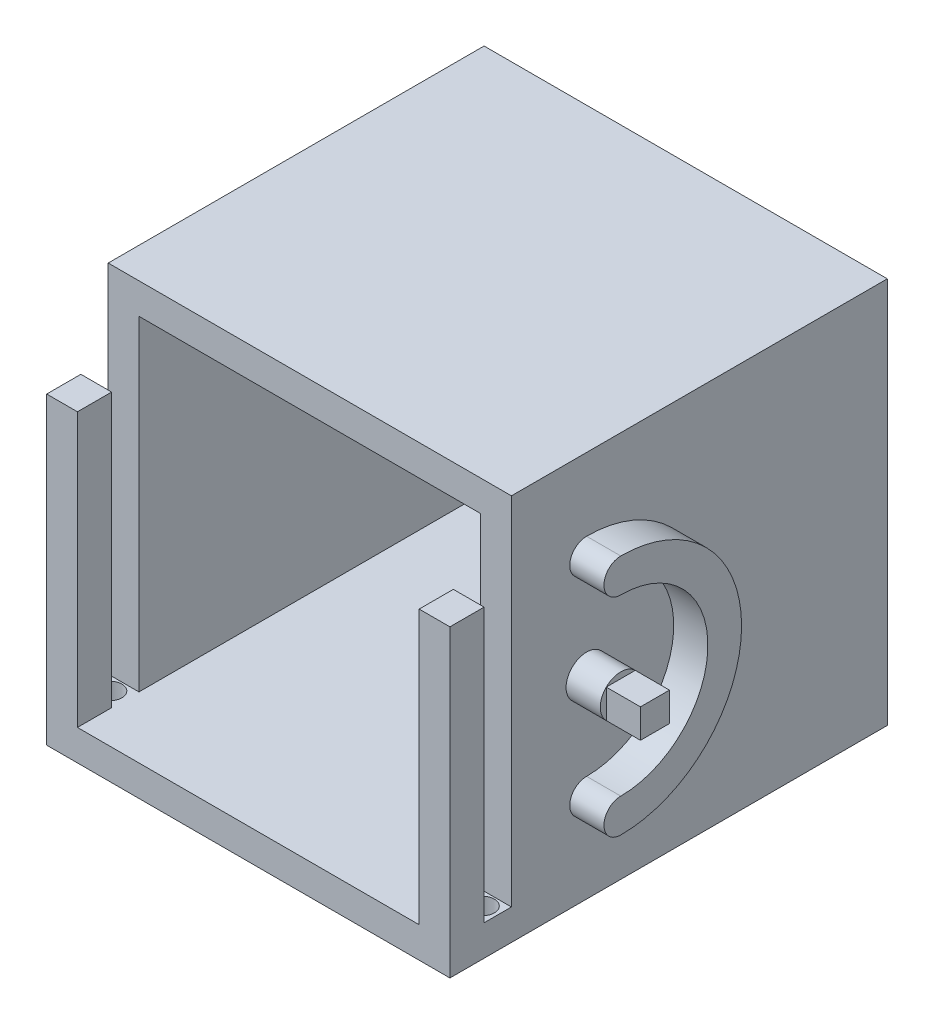
ISO-10303-21;
HEADER;
FILE_DESCRIPTION(('STEP AP214'),'2;1');
FILE_NAME('part.step','',(''),(''),'','','');
FILE_SCHEMA(('AUTOMOTIVE_DESIGN { 1 0 10303 214 1 1 1 1 }'));
ENDSEC;
DATA;
#1=APPLICATION_CONTEXT('core data for automotive mechanical design processes');
#2=APPLICATION_PROTOCOL_DEFINITION('international standard','automotive_design',2000,#1);
#3=PRODUCT_CONTEXT('',#1,'mechanical');
#4=PRODUCT('Part','Part','',(#3));
#5=PRODUCT_RELATED_PRODUCT_CATEGORY('part','',(#4));
#6=PRODUCT_DEFINITION_FORMATION('','',#4);
#7=PRODUCT_DEFINITION_CONTEXT('part definition',#1,'design');
#8=PRODUCT_DEFINITION('design','',#6,#7);
#9=PRODUCT_DEFINITION_SHAPE('','',#8);
#10=(LENGTH_UNIT() NAMED_UNIT(*) SI_UNIT(.MILLI.,.METRE.));
#11=(NAMED_UNIT(*) PLANE_ANGLE_UNIT() SI_UNIT($,.RADIAN.));
#12=(NAMED_UNIT(*) SI_UNIT($,.STERADIAN.) SOLID_ANGLE_UNIT());
#13=UNCERTAINTY_MEASURE_WITH_UNIT(LENGTH_MEASURE(1.E-05),#10,'distance_accuracy_value','');
#14=(GEOMETRIC_REPRESENTATION_CONTEXT(3) GLOBAL_UNCERTAINTY_ASSIGNED_CONTEXT((#13)) GLOBAL_UNIT_ASSIGNED_CONTEXT((#10,
#11,#12)) REPRESENTATION_CONTEXT('',''));
#15=CARTESIAN_POINT('',(0.,0.,0.));
#16=DIRECTION('',(0.,0.,1.));
#17=DIRECTION('',(1.,0.,0.));
#18=AXIS2_PLACEMENT_3D('',#15,#16,#17);
#19=CARTESIAN_POINT('',(34.5,0.,44.));
#20=DIRECTION('',(1.,0.,0.));
#21=DIRECTION('',(0.,0.,-1.));
#22=AXIS2_PLACEMENT_3D('',#19,#20,#21);
#23=PLANE('',#22);
#24=DIRECTION('',(0.,-1.,0.));
#25=VECTOR('',#24,1.);
#26=CARTESIAN_POINT('',(34.5,-2.12132034355965,46.1213203435596));
#27=LINE('',#26,#25);
#28=CARTESIAN_POINT('',(34.5,2.12132034355963,46.1213203435596));
#29=VERTEX_POINT('',#28);
#30=CARTESIAN_POINT('',(34.5,-2.12132034355965,46.1213203435596));
#31=VERTEX_POINT('',#30);
#32=EDGE_CURVE('E62',#29,#31,#27,.T.);
#33=ORIENTED_EDGE('',*,*,#32,.F.);
#34=CARTESIAN_POINT('',(34.5,0.,44.));
#35=DIRECTION('',(1.,0.,0.));
#36=DIRECTION('',(0.,0.,-1.));
#37=AXIS2_PLACEMENT_3D('',#34,#35,#36);
#38=CIRCLE('',#37,3.);
#39=EDGE_CURVE('E268',#29,#31,#38,.T.);
#40=ORIENTED_EDGE('',*,*,#39,.T.);
#41=EDGE_LOOP('',(#33,#40));
#42=FACE_BOUND('',#41,.T.);
#43=ADVANCED_FACE('F41',(#42),#23,.T.);
#44=DIRECTION('',(0.,0.,1.));
#45=VECTOR('',#44,1.);
#46=CARTESIAN_POINT('',(34.5,2.12132034355963,46.1213203435596));
#47=LINE('',#46,#45);
#48=CARTESIAN_POINT('',(34.5,2.12132034355963,41.8786796564403));
#49=VERTEX_POINT('',#48);
#50=EDGE_CURVE('E222',#49,#29,#47,.T.);
#51=ORIENTED_EDGE('',*,*,#50,.F.);
#52=EDGE_CURVE('E264',#49,#29,#38,.T.);
#53=ORIENTED_EDGE('',*,*,#52,.T.);
#54=EDGE_LOOP('',(#51,#53));
#55=FACE_BOUND('',#54,.T.);
#56=ADVANCED_FACE('F421',(#55),#23,.T.);
#57=DIRECTION('',(0.,1.,0.));
#58=VECTOR('',#57,1.);
#59=CARTESIAN_POINT('',(34.5,-2.12132034355965,41.8786796564403));
#60=LINE('',#59,#58);
#61=CARTESIAN_POINT('',(34.5,-2.12132034355965,41.8786796564403));
#62=VERTEX_POINT('',#61);
#63=EDGE_CURVE('E450',#62,#49,#60,.T.);
#64=ORIENTED_EDGE('',*,*,#63,.F.);
#65=EDGE_CURVE('E256',#62,#49,#38,.T.);
#66=ORIENTED_EDGE('',*,*,#65,.T.);
#67=EDGE_LOOP('',(#64,#66));
#68=FACE_BOUND('',#67,.T.);
#69=ADVANCED_FACE('F418',(#68),#23,.T.);
#70=CARTESIAN_POINT('',(-34.5,0.,44.));
#71=DIRECTION('',(1.,0.,0.));
#72=DIRECTION('',(0.,0.,1.));
#73=AXIS2_PLACEMENT_3D('',#70,#71,#72);
#74=CYLINDRICAL_SURFACE('',#73,3.);
#75=CARTESIAN_POINT('',(-34.5,0.,44.));
#76=DIRECTION('',(1.,0.,0.));
#77=DIRECTION('',(0.,0.,-1.));
#78=AXIS2_PLACEMENT_3D('',#75,#76,#77);
#79=CIRCLE('',#78,3.);
#80=CARTESIAN_POINT('',(-34.5,0.,41.));
#81=VERTEX_POINT('',#80);
#82=EDGE_CURVE('E49',#81,#81,#79,.T.);
#83=ORIENTED_EDGE('',*,*,#82,.T.);
#84=EDGE_LOOP('',(#83));
#85=FACE_BOUND('',#84,.T.);
#86=CARTESIAN_POINT('',(-29.5,0.,44.));
#87=DIRECTION('',(-1.,0.,0.));
#88=DIRECTION('',(0.,0.,1.));
#89=AXIS2_PLACEMENT_3D('',#86,#87,#88);
#90=CIRCLE('',#89,3.);
#91=CARTESIAN_POINT('',(-29.5,0.,47.));
#92=VERTEX_POINT('',#91);
#93=EDGE_CURVE('E11',#92,#92,#90,.F.);
#94=ORIENTED_EDGE('',*,*,#93,.F.);
#95=EDGE_LOOP('',(#94));
#96=FACE_BOUND('',#95,.T.);
#97=ADVANCED_FACE('F43',(#85,#96),#74,.T.);
#98=CARTESIAN_POINT('',(-34.5,0.,44.));
#99=DIRECTION('',(-1.,0.,0.));
#100=DIRECTION('',(0.,0.,-1.));
#101=AXIS2_PLACEMENT_3D('',#98,#99,#100);
#102=PLANE('',#101);
#103=ORIENTED_EDGE('',*,*,#82,.F.);
#104=EDGE_LOOP('',(#103));
#105=FACE_BOUND('',#104,.T.);
#106=ADVANCED_FACE('F407',(#105),#102,.T.);
#107=CARTESIAN_POINT('',(29.5,0.,3.));
#108=DIRECTION('',(-1.,0.,0.));
#109=DIRECTION('',(0.,0.,1.));
#110=AXIS2_PLACEMENT_3D('',#107,#108,#109);
#111=PLANE('',#110);
#112=DIRECTION('',(0.,1.,0.));
#113=VECTOR('',#112,1.);
#114=CARTESIAN_POINT('',(29.5,0.,0.));
#115=LINE('',#114,#113);
#116=CARTESIAN_POINT('',(29.5,-28.3,0.));
#117=VERTEX_POINT('',#116);
#118=CARTESIAN_POINT('',(29.5,28.3,0.));
#119=VERTEX_POINT('',#118);
#120=EDGE_CURVE('E385',#117,#119,#115,.T.);
#121=ORIENTED_EDGE('',*,*,#120,.T.);
#122=DIRECTION('',(0.,0.,-1.));
#123=VECTOR('',#122,1.);
#124=CARTESIAN_POINT('',(29.5,28.3,3.));
#125=LINE('',#124,#123);
#126=CARTESIAN_POINT('',(29.5,28.3,55.));
#127=VERTEX_POINT('',#126);
#128=EDGE_CURVE('E393',#127,#119,#125,.T.);
#129=ORIENTED_EDGE('',*,*,#128,.F.);
#130=DIRECTION('',(0.,-1.,0.));
#131=VECTOR('',#130,1.);
#132=CARTESIAN_POINT('',(29.5,0.,55.));
#133=LINE('',#132,#131);
#134=CARTESIAN_POINT('',(29.5,-23.8,55.));
#135=VERTEX_POINT('',#134);
#136=EDGE_CURVE('E375',#127,#135,#133,.T.);
#137=ORIENTED_EDGE('',*,*,#136,.T.);
#138=DIRECTION('',(0.,0.,-1.));
#139=VECTOR('',#138,1.);
#140=CARTESIAN_POINT('',(29.5,-23.8,59.));
#141=LINE('',#140,#139);
#142=CARTESIAN_POINT('',(29.5,-23.8,59.));
#143=VERTEX_POINT('',#142);
#144=EDGE_CURVE('E340',#143,#135,#141,.T.);
#145=ORIENTED_EDGE('',*,*,#144,.F.);
#146=DIRECTION('',(0.,1.,0.));
#147=VECTOR('',#146,1.);
#148=CARTESIAN_POINT('',(29.5,16.2,59.));
#149=LINE('',#148,#147);
#150=CARTESIAN_POINT('',(29.5,16.2,59.));
#151=VERTEX_POINT('',#150);
#152=EDGE_CURVE('E272',#143,#151,#149,.T.);
#153=ORIENTED_EDGE('',*,*,#152,.T.);
#154=DIRECTION('',(0.,0.,-1.));
#155=VECTOR('',#154,1.);
#156=CARTESIAN_POINT('',(29.5,16.2,64.));
#157=LINE('',#156,#155);
#158=CARTESIAN_POINT('',(29.5,16.2,64.));
#159=VERTEX_POINT('',#158);
#160=EDGE_CURVE('E327',#159,#151,#157,.T.);
#161=ORIENTED_EDGE('',*,*,#160,.F.);
#162=DIRECTION('',(0.,1.,0.));
#163=VECTOR('',#162,1.);
#164=CARTESIAN_POINT('',(29.5,16.2,64.));
#165=LINE('',#164,#163);
#166=CARTESIAN_POINT('',(29.5,-28.3,64.));
#167=VERTEX_POINT('',#166);
#168=EDGE_CURVE('E284',#167,#159,#165,.T.);
#169=ORIENTED_EDGE('',*,*,#168,.F.);
#170=DIRECTION('',(0.,0.,-1.));
#171=VECTOR('',#170,1.);
#172=CARTESIAN_POINT('',(29.5,-28.3,3.));
#173=LINE('',#172,#171);
#174=EDGE_CURVE('E395',#167,#117,#173,.T.);
#175=ORIENTED_EDGE('',*,*,#174,.T.);
#176=EDGE_LOOP('',(#121,#129,#137,#145,#153,#161,#169,#175));
#177=FACE_BOUND('',#176,.T.);
#178=CARTESIAN_POINT('',(29.5,0.,44.));
#179=DIRECTION('',(-1.,0.,0.));
#180=DIRECTION('',(0.,0.,1.));
#181=AXIS2_PLACEMENT_3D('',#178,#179,#180);
#182=CIRCLE('',#181,3.);
#183=CARTESIAN_POINT('',(29.5,0.,47.));
#184=VERTEX_POINT('',#183);
#185=EDGE_CURVE('E400',#184,#184,#182,.F.);
#186=ORIENTED_EDGE('',*,*,#185,.F.);
#187=EDGE_LOOP('',(#186));
#188=FACE_BOUND('',#187,.T.);
#189=CARTESIAN_POINT('',(29.5,-15.2126091568228,44.));
#190=DIRECTION('',(1.,0.,0.));
#191=DIRECTION('',(0.,0.,-1.));
#192=AXIS2_PLACEMENT_3D('',#189,#190,#191);
#193=CIRCLE('',#192,2.46506037284086);
#194=CARTESIAN_POINT('',(29.5,-12.747548783982,44.));
#195=VERTEX_POINT('',#194);
#196=CARTESIAN_POINT('',(29.5,-17.6776695296637,44.));
#197=VERTEX_POINT('',#196);
#198=EDGE_CURVE('E253',#195,#197,#193,.T.);
#199=ORIENTED_EDGE('',*,*,#198,.F.);
#200=CARTESIAN_POINT('',(29.5,0.,44.));
#201=DIRECTION('',(-1.,0.,0.));
#202=DIRECTION('',(0.,0.,-1.));
#203=AXIS2_PLACEMENT_3D('',#200,#201,#202);
#204=CIRCLE('',#203,12.747548783982);
#205=CARTESIAN_POINT('',(29.5,12.747548783982,44.));
#206=VERTEX_POINT('',#205);
#207=EDGE_CURVE('E243',#206,#195,#204,.T.);
#208=ORIENTED_EDGE('',*,*,#207,.F.);
#209=CARTESIAN_POINT('',(29.5,15.2126091568229,44.));
#210=DIRECTION('',(1.,0.,0.));
#211=DIRECTION('',(0.,0.,-1.));
#212=AXIS2_PLACEMENT_3D('',#209,#210,#211);
#213=CIRCLE('',#212,2.46506037284086);
#214=CARTESIAN_POINT('',(29.5,17.6776695296637,44.));
#215=VERTEX_POINT('',#214);
#216=EDGE_CURVE('E246',#215,#206,#213,.T.);
#217=ORIENTED_EDGE('',*,*,#216,.F.);
#218=CARTESIAN_POINT('',(29.5,0.,44.));
#219=DIRECTION('',(1.,0.,0.));
#220=DIRECTION('',(0.,0.,-1.));
#221=AXIS2_PLACEMENT_3D('',#218,#219,#220);
#222=CIRCLE('',#221,17.6776695296637);
#223=EDGE_CURVE('E250',#197,#215,#222,.T.);
#224=ORIENTED_EDGE('',*,*,#223,.F.);
#225=EDGE_LOOP('',(#199,#208,#217,#224));
#226=FACE_BOUND('',#225,.T.);
#227=ADVANCED_FACE('F409',(#177,#188,#226),#111,.F.);
#228=CARTESIAN_POINT('',(0.,0.,55.));
#229=DIRECTION('',(0.,0.,-1.));
#230=DIRECTION('',(-1.,0.,0.));
#231=AXIS2_PLACEMENT_3D('',#228,#229,#230);
#232=PLANE('',#231);
#233=DIRECTION('',(-1.,0.,0.));
#234=VECTOR('',#233,1.);
#235=CARTESIAN_POINT('',(-29.5,-23.8,55.));
#236=LINE('',#235,#234);
#237=CARTESIAN_POINT('',(25.,-23.8,55.));
#238=VERTEX_POINT('',#237);
#239=EDGE_CURVE('E330',#135,#238,#236,.T.);
#240=ORIENTED_EDGE('',*,*,#239,.F.);
#241=ORIENTED_EDGE('',*,*,#136,.F.);
#242=DIRECTION('',(1.,0.,0.));
#243=VECTOR('',#242,1.);
#244=CARTESIAN_POINT('',(0.,28.3,55.));
#245=LINE('',#244,#243);
#246=CARTESIAN_POINT('',(-29.5,28.3,55.));
#247=VERTEX_POINT('',#246);
#248=EDGE_CURVE('E367',#247,#127,#245,.T.);
#249=ORIENTED_EDGE('',*,*,#248,.F.);
#250=DIRECTION('',(0.,1.,0.));
#251=VECTOR('',#250,1.);
#252=CARTESIAN_POINT('',(-29.5,0.,55.));
#253=LINE('',#252,#251);
#254=CARTESIAN_POINT('',(-29.5,-23.8,55.));
#255=VERTEX_POINT('',#254);
#256=EDGE_CURVE('E378',#255,#247,#253,.T.);
#257=ORIENTED_EDGE('',*,*,#256,.F.);
#258=CARTESIAN_POINT('',(-25.,-23.8,55.));
#259=VERTEX_POINT('',#258);
#260=EDGE_CURVE('E337',#259,#255,#236,.T.);
#261=ORIENTED_EDGE('',*,*,#260,.F.);
#262=DIRECTION('',(0.,1.,0.));
#263=VECTOR('',#262,1.);
#264=CARTESIAN_POINT('',(-25.,0.,55.));
#265=LINE('',#264,#263);
#266=CARTESIAN_POINT('',(-25.,23.8,55.));
#267=VERTEX_POINT('',#266);
#268=EDGE_CURVE('E351',#259,#267,#265,.T.);
#269=ORIENTED_EDGE('',*,*,#268,.T.);
#270=DIRECTION('',(1.,0.,0.));
#271=VECTOR('',#270,1.);
#272=CARTESIAN_POINT('',(0.,23.8,55.));
#273=LINE('',#272,#271);
#274=CARTESIAN_POINT('',(25.,23.8,55.));
#275=VERTEX_POINT('',#274);
#276=EDGE_CURVE('E344',#267,#275,#273,.T.);
#277=ORIENTED_EDGE('',*,*,#276,.T.);
#278=DIRECTION('',(0.,-1.,0.));
#279=VECTOR('',#278,1.);
#280=CARTESIAN_POINT('',(25.,0.,55.));
#281=LINE('',#280,#279);
#282=EDGE_CURVE('E347',#275,#238,#281,.T.);
#283=ORIENTED_EDGE('',*,*,#282,.T.);
#284=EDGE_LOOP('',(#240,#241,#249,#257,#261,#269,#277,#283));
#285=FACE_BOUND('',#284,.T.);
#286=ADVANCED_FACE('F415',(#285),#232,.F.);
#287=CARTESIAN_POINT('',(-29.5,0.,3.));
#288=DIRECTION('',(-1.,0.,0.));
#289=DIRECTION('',(0.,0.,1.));
#290=AXIS2_PLACEMENT_3D('',#287,#288,#289);
#291=PLANE('',#290);
#292=ORIENTED_EDGE('',*,*,#93,.T.);
#293=EDGE_LOOP('',(#292));
#294=FACE_BOUND('',#293,.T.);
#295=DIRECTION('',(0.,1.,0.));
#296=VECTOR('',#295,1.);
#297=CARTESIAN_POINT('',(-29.5,0.,0.));
#298=LINE('',#297,#296);
#299=CARTESIAN_POINT('',(-29.5,-28.3,0.));
#300=VERTEX_POINT('',#299);
#301=CARTESIAN_POINT('',(-29.5,28.3,0.));
#302=VERTEX_POINT('',#301);
#303=EDGE_CURVE('E380',#300,#302,#298,.T.);
#304=ORIENTED_EDGE('',*,*,#303,.F.);
#305=DIRECTION('',(0.,0.,-1.));
#306=VECTOR('',#305,1.);
#307=CARTESIAN_POINT('',(-29.5,-28.3,3.));
#308=LINE('',#307,#306);
#309=CARTESIAN_POINT('',(-29.5,-28.3,64.));
#310=VERTEX_POINT('',#309);
#311=EDGE_CURVE('E398',#310,#300,#308,.T.);
#312=ORIENTED_EDGE('',*,*,#311,.F.);
#313=DIRECTION('',(0.,-1.,0.));
#314=VECTOR('',#313,1.);
#315=CARTESIAN_POINT('',(-29.5,-28.3,64.));
#316=LINE('',#315,#314);
#317=CARTESIAN_POINT('',(-29.5,16.2,64.));
#318=VERTEX_POINT('',#317);
#319=EDGE_CURVE('E297',#318,#310,#316,.T.);
#320=ORIENTED_EDGE('',*,*,#319,.F.);
#321=DIRECTION('',(0.,0.,-1.));
#322=VECTOR('',#321,1.);
#323=CARTESIAN_POINT('',(-29.5,16.2,64.));
#324=LINE('',#323,#322);
#325=CARTESIAN_POINT('',(-29.5,16.2,59.));
#326=VERTEX_POINT('',#325);
#327=EDGE_CURVE('E300',#318,#326,#324,.T.);
#328=ORIENTED_EDGE('',*,*,#327,.T.);
#329=DIRECTION('',(0.,-1.,0.));
#330=VECTOR('',#329,1.);
#331=CARTESIAN_POINT('',(-29.5,-28.3,59.));
#332=LINE('',#331,#330);
#333=CARTESIAN_POINT('',(-29.5,-23.8,59.));
#334=VERTEX_POINT('',#333);
#335=EDGE_CURVE('E285',#326,#334,#332,.T.);
#336=ORIENTED_EDGE('',*,*,#335,.T.);
#337=DIRECTION('',(0.,0.,-1.));
#338=VECTOR('',#337,1.);
#339=CARTESIAN_POINT('',(-29.5,-23.8,59.));
#340=LINE('',#339,#338);
#341=EDGE_CURVE('E333',#334,#255,#340,.T.);
#342=ORIENTED_EDGE('',*,*,#341,.T.);
#343=ORIENTED_EDGE('',*,*,#256,.T.);
#344=DIRECTION('',(0.,0.,-1.));
#345=VECTOR('',#344,1.);
#346=CARTESIAN_POINT('',(-29.5,28.3,3.));
#347=LINE('',#346,#345);
#348=EDGE_CURVE('E391',#247,#302,#347,.T.);
#349=ORIENTED_EDGE('',*,*,#348,.T.);
#350=EDGE_LOOP('',(#304,#312,#320,#328,#336,#342,#343,#349));
#351=FACE_BOUND('',#350,.T.);
#352=ADVANCED_FACE('F691',(#294,#351),#291,.T.);
#353=CARTESIAN_POINT('',(0.,-28.3,3.));
#354=DIRECTION('',(0.,1.,0.));
#355=DIRECTION('',(0.,0.,1.));
#356=AXIS2_PLACEMENT_3D('',#353,#354,#355);
#357=PLANE('',#356);
#358=CARTESIAN_POINT('',(-27.25,-28.3,57.));
#359=DIRECTION('',(0.,1.,0.));
#360=DIRECTION('',(0.,0.,1.));
#361=AXIS2_PLACEMENT_3D('',#358,#359,#360);
#362=CIRCLE('',#361,1.75);
#363=CARTESIAN_POINT('',(-27.25,-28.3,58.75));
#364=VERTEX_POINT('',#363);
#365=EDGE_CURVE('E269',#364,#364,#362,.T.);
#366=ORIENTED_EDGE('',*,*,#365,.T.);
#367=EDGE_LOOP('',(#366));
#368=FACE_BOUND('',#367,.T.);
#369=CARTESIAN_POINT('',(27.25,-28.3,57.));
#370=DIRECTION('',(0.,1.,0.));
#371=DIRECTION('',(0.,0.,1.));
#372=AXIS2_PLACEMENT_3D('',#369,#370,#371);
#373=CIRCLE('',#372,1.75);
#374=CARTESIAN_POINT('',(27.25,-28.3,58.75));
#375=VERTEX_POINT('',#374);
#376=EDGE_CURVE('E267',#375,#375,#373,.T.);
#377=ORIENTED_EDGE('',*,*,#376,.T.);
#378=EDGE_LOOP('',(#377));
#379=FACE_BOUND('',#378,.T.);
#380=DIRECTION('',(1.,0.,0.));
#381=VECTOR('',#380,1.);
#382=CARTESIAN_POINT('',(0.,-28.3,0.));
#383=LINE('',#382,#381);
#384=EDGE_CURVE('E383',#300,#117,#383,.T.);
#385=ORIENTED_EDGE('',*,*,#384,.T.);
#386=ORIENTED_EDGE('',*,*,#174,.F.);
#387=DIRECTION('',(1.,0.,0.));
#388=VECTOR('',#387,1.);
#389=CARTESIAN_POINT('',(29.5,-28.3,64.));
#390=LINE('',#389,#388);
#391=EDGE_CURVE('E281',#310,#167,#390,.T.);
#392=ORIENTED_EDGE('',*,*,#391,.F.);
#393=ORIENTED_EDGE('',*,*,#311,.T.);
#394=EDGE_LOOP('',(#385,#386,#392,#393));
#395=FACE_BOUND('',#394,.T.);
#396=ADVANCED_FACE('F760',(#368,#379,#395),#357,.F.);
#397=CARTESIAN_POINT('',(0.,28.3,3.));
#398=DIRECTION('',(0.,1.,0.));
#399=DIRECTION('',(-1.,0.,0.));
#400=AXIS2_PLACEMENT_3D('',#397,#398,#399);
#401=PLANE('',#400);
#402=DIRECTION('',(1.,0.,0.));
#403=VECTOR('',#402,1.);
#404=CARTESIAN_POINT('',(0.,28.3,0.));
#405=LINE('',#404,#403);
#406=EDGE_CURVE('E388',#302,#119,#405,.T.);
#407=ORIENTED_EDGE('',*,*,#406,.F.);
#408=ORIENTED_EDGE('',*,*,#348,.F.);
#409=ORIENTED_EDGE('',*,*,#248,.T.);
#410=ORIENTED_EDGE('',*,*,#128,.T.);
#411=EDGE_LOOP('',(#407,#408,#409,#410));
#412=FACE_BOUND('',#411,.T.);
#413=ADVANCED_FACE('F751',(#412),#401,.T.);
#414=CARTESIAN_POINT('',(0.,0.,0.));
#415=DIRECTION('',(0.,0.,1.));
#416=DIRECTION('',(1.,0.,0.));
#417=AXIS2_PLACEMENT_3D('',#414,#415,#416);
#418=PLANE('',#417);
#419=ORIENTED_EDGE('',*,*,#303,.T.);
#420=ORIENTED_EDGE('',*,*,#406,.T.);
#421=ORIENTED_EDGE('',*,*,#120,.F.);
#422=ORIENTED_EDGE('',*,*,#384,.F.);
#423=EDGE_LOOP('',(#419,#420,#421,#422));
#424=FACE_BOUND('',#423,.T.);
#425=ADVANCED_FACE('F732',(#424),#418,.F.);
#426=CARTESIAN_POINT('',(0.,23.8,55.));
#427=DIRECTION('',(0.,1.,0.));
#428=DIRECTION('',(0.,0.,1.));
#429=AXIS2_PLACEMENT_3D('',#426,#427,#428);
#430=PLANE('',#429);
#431=DIRECTION('',(1.,0.,0.));
#432=VECTOR('',#431,1.);
#433=CARTESIAN_POINT('',(0.,23.8,3.));
#434=LINE('',#433,#432);
#435=CARTESIAN_POINT('',(-25.,23.8,3.));
#436=VERTEX_POINT('',#435);
#437=CARTESIAN_POINT('',(25.,23.8,3.));
#438=VERTEX_POINT('',#437);
#439=EDGE_CURVE('E343',#436,#438,#434,.T.);
#440=ORIENTED_EDGE('',*,*,#439,.T.);
#441=DIRECTION('',(0.,0.,-1.));
#442=VECTOR('',#441,1.);
#443=CARTESIAN_POINT('',(25.,23.8,55.));
#444=LINE('',#443,#442);
#445=EDGE_CURVE('E354',#275,#438,#444,.T.);
#446=ORIENTED_EDGE('',*,*,#445,.F.);
#447=ORIENTED_EDGE('',*,*,#276,.F.);
#448=DIRECTION('',(0.,0.,-1.));
#449=VECTOR('',#448,1.);
#450=CARTESIAN_POINT('',(-25.,23.8,55.));
#451=LINE('',#450,#449);
#452=EDGE_CURVE('E365',#267,#436,#451,.T.);
#453=ORIENTED_EDGE('',*,*,#452,.T.);
#454=EDGE_LOOP('',(#440,#446,#447,#453));
#455=FACE_BOUND('',#454,.T.);
#456=ADVANCED_FACE('F723',(#455),#430,.F.);
#457=CARTESIAN_POINT('',(-25.,0.,55.));
#458=DIRECTION('',(-1.,0.,0.));
#459=DIRECTION('',(0.,0.,1.));
#460=AXIS2_PLACEMENT_3D('',#457,#458,#459);
#461=PLANE('',#460);
#462=DIRECTION('',(0.,1.,0.));
#463=VECTOR('',#462,1.);
#464=CARTESIAN_POINT('',(-25.,0.,3.));
#465=LINE('',#464,#463);
#466=CARTESIAN_POINT('',(-25.,-23.8,3.));
#467=VERTEX_POINT('',#466);
#468=EDGE_CURVE('E348',#467,#436,#465,.T.);
#469=ORIENTED_EDGE('',*,*,#468,.T.);
#470=ORIENTED_EDGE('',*,*,#452,.F.);
#471=ORIENTED_EDGE('',*,*,#268,.F.);
#472=DIRECTION('',(0.,0.,-1.));
#473=VECTOR('',#472,1.);
#474=CARTESIAN_POINT('',(-25.,-23.8,55.));
#475=LINE('',#474,#473);
#476=EDGE_CURVE('E368',#259,#467,#475,.T.);
#477=ORIENTED_EDGE('',*,*,#476,.T.);
#478=EDGE_LOOP('',(#469,#470,#471,#477));
#479=FACE_BOUND('',#478,.T.);
#480=ADVANCED_FACE('F714',(#479),#461,.F.);
#481=CARTESIAN_POINT('',(0.,-23.8,55.));
#482=DIRECTION('',(0.,-1.,0.));
#483=DIRECTION('',(0.,0.,-1.));
#484=AXIS2_PLACEMENT_3D('',#481,#482,#483);
#485=PLANE('',#484);
#486=CARTESIAN_POINT('',(-27.25,-23.8,57.));
#487=DIRECTION('',(0.,1.,0.));
#488=DIRECTION('',(0.,0.,1.));
#489=AXIS2_PLACEMENT_3D('',#486,#487,#488);
#490=CIRCLE('',#489,1.75);
#491=CARTESIAN_POINT('',(-27.25,-23.8,58.75));
#492=VERTEX_POINT('',#491);
#493=EDGE_CURVE('E273',#492,#492,#490,.T.);
#494=ORIENTED_EDGE('',*,*,#493,.F.);
#495=EDGE_LOOP('',(#494));
#496=FACE_BOUND('',#495,.T.);
#497=CARTESIAN_POINT('',(27.25,-23.8,57.));
#498=DIRECTION('',(0.,1.,0.));
#499=DIRECTION('',(0.,0.,1.));
#500=AXIS2_PLACEMENT_3D('',#497,#498,#499);
#501=CIRCLE('',#500,1.75);
#502=CARTESIAN_POINT('',(27.25,-23.8,58.75));
#503=VERTEX_POINT('',#502);
#504=EDGE_CURVE('E276',#503,#503,#501,.T.);
#505=ORIENTED_EDGE('',*,*,#504,.F.);
#506=EDGE_LOOP('',(#505));
#507=FACE_BOUND('',#506,.T.);
#508=DIRECTION('',(-1.,0.,0.));
#509=VECTOR('',#508,1.);
#510=CARTESIAN_POINT('',(0.,-23.8,3.));
#511=LINE('',#510,#509);
#512=CARTESIAN_POINT('',(25.,-23.8,3.));
#513=VERTEX_POINT('',#512);
#514=EDGE_CURVE('E360',#513,#467,#511,.T.);
#515=ORIENTED_EDGE('',*,*,#514,.T.);
#516=ORIENTED_EDGE('',*,*,#476,.F.);
#517=ORIENTED_EDGE('',*,*,#260,.T.);
#518=ORIENTED_EDGE('',*,*,#341,.F.);
#519=DIRECTION('',(-1.,0.,0.));
#520=VECTOR('',#519,1.);
#521=CARTESIAN_POINT('',(-29.5,-23.8,59.));
#522=LINE('',#521,#520);
#523=CARTESIAN_POINT('',(-25.,-23.8,59.));
#524=VERTEX_POINT('',#523);
#525=EDGE_CURVE('E334',#524,#334,#522,.T.);
#526=ORIENTED_EDGE('',*,*,#525,.F.);
#527=DIRECTION('',(0.,0.,-1.));
#528=VECTOR('',#527,1.);
#529=CARTESIAN_POINT('',(-25.,-23.8,64.));
#530=LINE('',#529,#528);
#531=CARTESIAN_POINT('',(-25.,-23.8,64.));
#532=VERTEX_POINT('',#531);
#533=EDGE_CURVE('E318',#532,#524,#530,.T.);
#534=ORIENTED_EDGE('',*,*,#533,.F.);
#535=DIRECTION('',(-1.,0.,0.));
#536=VECTOR('',#535,1.);
#537=CARTESIAN_POINT('',(-25.,-23.8,64.));
#538=LINE('',#537,#536);
#539=CARTESIAN_POINT('',(25.,-23.8,64.));
#540=VERTEX_POINT('',#539);
#541=EDGE_CURVE('E291',#540,#532,#538,.T.);
#542=ORIENTED_EDGE('',*,*,#541,.F.);
#543=DIRECTION('',(0.,0.,-1.));
#544=VECTOR('',#543,1.);
#545=CARTESIAN_POINT('',(25.,-23.8,64.));
#546=LINE('',#545,#544);
#547=CARTESIAN_POINT('',(25.,-23.8,59.));
#548=VERTEX_POINT('',#547);
#549=EDGE_CURVE('E321',#540,#548,#546,.T.);
#550=ORIENTED_EDGE('',*,*,#549,.T.);
#551=EDGE_CURVE('E331',#143,#548,#522,.T.);
#552=ORIENTED_EDGE('',*,*,#551,.F.);
#553=ORIENTED_EDGE('',*,*,#144,.T.);
#554=ORIENTED_EDGE('',*,*,#239,.T.);
#555=DIRECTION('',(0.,0.,-1.));
#556=VECTOR('',#555,1.);
#557=CARTESIAN_POINT('',(25.,-23.8,55.));
#558=LINE('',#557,#556);
#559=EDGE_CURVE('E370',#238,#513,#558,.T.);
#560=ORIENTED_EDGE('',*,*,#559,.T.);
#561=EDGE_LOOP('',(#515,#516,#517,#518,#526,#534,#542,#550,#552,#553,#554,#560));
#562=FACE_BOUND('',#561,.T.);
#563=ADVANCED_FACE('F705',(#496,#507,#562),#485,.F.);
#564=CARTESIAN_POINT('',(25.,0.,55.));
#565=DIRECTION('',(1.,0.,0.));
#566=DIRECTION('',(0.,0.,-1.));
#567=AXIS2_PLACEMENT_3D('',#564,#565,#566);
#568=PLANE('',#567);
#569=DIRECTION('',(0.,-1.,0.));
#570=VECTOR('',#569,1.);
#571=CARTESIAN_POINT('',(25.,0.,3.));
#572=LINE('',#571,#570);
#573=EDGE_CURVE('E357',#438,#513,#572,.T.);
#574=ORIENTED_EDGE('',*,*,#573,.T.);
#575=ORIENTED_EDGE('',*,*,#559,.F.);
#576=ORIENTED_EDGE('',*,*,#282,.F.);
#577=ORIENTED_EDGE('',*,*,#445,.T.);
#578=EDGE_LOOP('',(#574,#575,#576,#577));
#579=FACE_BOUND('',#578,.T.);
#580=ADVANCED_FACE('F701',(#579),#568,.F.);
#581=CARTESIAN_POINT('',(0.,0.,3.));
#582=DIRECTION('',(0.,0.,1.));
#583=DIRECTION('',(1.,0.,0.));
#584=AXIS2_PLACEMENT_3D('',#581,#582,#583);
#585=PLANE('',#584);
#586=ORIENTED_EDGE('',*,*,#573,.F.);
#587=ORIENTED_EDGE('',*,*,#439,.F.);
#588=ORIENTED_EDGE('',*,*,#468,.F.);
#589=ORIENTED_EDGE('',*,*,#514,.F.);
#590=EDGE_LOOP('',(#586,#587,#588,#589));
#591=FACE_BOUND('',#590,.T.);
#592=ADVANCED_FACE('F682',(#591),#585,.T.);
#593=CARTESIAN_POINT('',(0.,0.,59.));
#594=DIRECTION('',(0.,0.,-1.));
#595=DIRECTION('',(-1.,0.,0.));
#596=AXIS2_PLACEMENT_3D('',#593,#594,#595);
#597=PLANE('',#596);
#598=ORIENTED_EDGE('',*,*,#152,.F.);
#599=ORIENTED_EDGE('',*,*,#551,.T.);
#600=DIRECTION('',(0.,-1.,0.));
#601=VECTOR('',#600,1.);
#602=CARTESIAN_POINT('',(25.,-23.8,59.));
#603=LINE('',#602,#601);
#604=CARTESIAN_POINT('',(25.,16.2,59.));
#605=VERTEX_POINT('',#604);
#606=EDGE_CURVE('E304',#605,#548,#603,.T.);
#607=ORIENTED_EDGE('',*,*,#606,.F.);
#608=DIRECTION('',(-1.,0.,0.));
#609=VECTOR('',#608,1.);
#610=CARTESIAN_POINT('',(25.,16.2,59.));
#611=LINE('',#610,#609);
#612=EDGE_CURVE('E302',#151,#605,#611,.T.);
#613=ORIENTED_EDGE('',*,*,#612,.F.);
#614=EDGE_LOOP('',(#598,#599,#607,#613));
#615=FACE_BOUND('',#614,.T.);
#616=ADVANCED_FACE('F631',(#615),#597,.T.);
#617=CARTESIAN_POINT('',(25.,16.2,64.));
#618=DIRECTION('',(0.,-1.,0.));
#619=DIRECTION('',(0.,0.,-1.));
#620=AXIS2_PLACEMENT_3D('',#617,#618,#619);
#621=PLANE('',#620);
#622=ORIENTED_EDGE('',*,*,#612,.T.);
#623=DIRECTION('',(0.,0.,-1.));
#624=VECTOR('',#623,1.);
#625=CARTESIAN_POINT('',(25.,16.2,64.));
#626=LINE('',#625,#624);
#627=CARTESIAN_POINT('',(25.,16.2,64.));
#628=VERTEX_POINT('',#627);
#629=EDGE_CURVE('E324',#628,#605,#626,.T.);
#630=ORIENTED_EDGE('',*,*,#629,.F.);
#631=DIRECTION('',(-1.,0.,0.));
#632=VECTOR('',#631,1.);
#633=CARTESIAN_POINT('',(25.,16.2,64.));
#634=LINE('',#633,#632);
#635=EDGE_CURVE('E287',#159,#628,#634,.T.);
#636=ORIENTED_EDGE('',*,*,#635,.F.);
#637=ORIENTED_EDGE('',*,*,#160,.T.);
#638=EDGE_LOOP('',(#622,#630,#636,#637));
#639=FACE_BOUND('',#638,.T.);
#640=ADVANCED_FACE('F665',(#639),#621,.F.);
#641=CARTESIAN_POINT('',(25.,-23.8,64.));
#642=DIRECTION('',(1.,0.,0.));
#643=DIRECTION('',(0.,1.,0.));
#644=AXIS2_PLACEMENT_3D('',#641,#642,#643);
#645=PLANE('',#644);
#646=ORIENTED_EDGE('',*,*,#606,.T.);
#647=ORIENTED_EDGE('',*,*,#549,.F.);
#648=DIRECTION('',(0.,-1.,0.));
#649=VECTOR('',#648,1.);
#650=CARTESIAN_POINT('',(25.,-23.8,64.));
#651=LINE('',#650,#649);
#652=EDGE_CURVE('E289',#628,#540,#651,.T.);
#653=ORIENTED_EDGE('',*,*,#652,.F.);
#654=ORIENTED_EDGE('',*,*,#629,.T.);
#655=EDGE_LOOP('',(#646,#647,#653,#654));
#656=FACE_BOUND('',#655,.T.);
#657=ADVANCED_FACE('F656',(#656),#645,.F.);
#658=CARTESIAN_POINT('',(-25.,16.2,64.));
#659=DIRECTION('',(-1.,0.,0.));
#660=DIRECTION('',(0.,0.,1.));
#661=AXIS2_PLACEMENT_3D('',#658,#659,#660);
#662=PLANE('',#661);
#663=DIRECTION('',(0.,1.,0.));
#664=VECTOR('',#663,1.);
#665=CARTESIAN_POINT('',(-25.,16.2,59.));
#666=LINE('',#665,#664);
#667=CARTESIAN_POINT('',(-25.,16.2,59.));
#668=VERTEX_POINT('',#667);
#669=EDGE_CURVE('E307',#524,#668,#666,.T.);
#670=ORIENTED_EDGE('',*,*,#669,.T.);
#671=DIRECTION('',(0.,0.,-1.));
#672=VECTOR('',#671,1.);
#673=CARTESIAN_POINT('',(-25.,16.2,64.));
#674=LINE('',#673,#672);
#675=CARTESIAN_POINT('',(-25.,16.2,64.));
#676=VERTEX_POINT('',#675);
#677=EDGE_CURVE('E315',#676,#668,#674,.T.);
#678=ORIENTED_EDGE('',*,*,#677,.F.);
#679=DIRECTION('',(0.,1.,0.));
#680=VECTOR('',#679,1.);
#681=CARTESIAN_POINT('',(-25.,16.2,64.));
#682=LINE('',#681,#680);
#683=EDGE_CURVE('E293',#532,#676,#682,.T.);
#684=ORIENTED_EDGE('',*,*,#683,.F.);
#685=ORIENTED_EDGE('',*,*,#533,.T.);
#686=EDGE_LOOP('',(#670,#678,#684,#685));
#687=FACE_BOUND('',#686,.T.);
#688=ADVANCED_FACE('F647',(#687),#662,.F.);
#689=CARTESIAN_POINT('',(-29.5,16.2,64.));
#690=DIRECTION('',(0.,-1.,0.));
#691=DIRECTION('',(1.,0.,0.));
#692=AXIS2_PLACEMENT_3D('',#689,#690,#691);
#693=PLANE('',#692);
#694=DIRECTION('',(-1.,0.,0.));
#695=VECTOR('',#694,1.);
#696=CARTESIAN_POINT('',(-29.5,16.2,59.));
#697=LINE('',#696,#695);
#698=EDGE_CURVE('E309',#668,#326,#697,.T.);
#699=ORIENTED_EDGE('',*,*,#698,.T.);
#700=ORIENTED_EDGE('',*,*,#327,.F.);
#701=DIRECTION('',(-1.,0.,0.));
#702=VECTOR('',#701,1.);
#703=CARTESIAN_POINT('',(-29.5,16.2,64.));
#704=LINE('',#703,#702);
#705=EDGE_CURVE('E295',#676,#318,#704,.T.);
#706=ORIENTED_EDGE('',*,*,#705,.F.);
#707=ORIENTED_EDGE('',*,*,#677,.T.);
#708=EDGE_LOOP('',(#699,#700,#706,#707));
#709=FACE_BOUND('',#708,.T.);
#710=ADVANCED_FACE('F638',(#709),#693,.F.);
#711=CARTESIAN_POINT('',(0.,0.,64.));
#712=DIRECTION('',(0.,0.,-1.));
#713=DIRECTION('',(-1.,0.,0.));
#714=AXIS2_PLACEMENT_3D('',#711,#712,#713);
#715=PLANE('',#714);
#716=ORIENTED_EDGE('',*,*,#391,.T.);
#717=ORIENTED_EDGE('',*,*,#168,.T.);
#718=ORIENTED_EDGE('',*,*,#635,.T.);
#719=ORIENTED_EDGE('',*,*,#652,.T.);
#720=ORIENTED_EDGE('',*,*,#541,.T.);
#721=ORIENTED_EDGE('',*,*,#683,.T.);
#722=ORIENTED_EDGE('',*,*,#705,.T.);
#723=ORIENTED_EDGE('',*,*,#319,.T.);
#724=EDGE_LOOP('',(#716,#717,#718,#719,#720,#721,#722,#723));
#725=FACE_BOUND('',#724,.T.);
#726=ADVANCED_FACE('F628',(#725),#715,.F.);
#727=ORIENTED_EDGE('',*,*,#669,.F.);
#728=ORIENTED_EDGE('',*,*,#525,.T.);
#729=ORIENTED_EDGE('',*,*,#335,.F.);
#730=ORIENTED_EDGE('',*,*,#698,.F.);
#731=EDGE_LOOP('',(#727,#728,#729,#730));
#732=FACE_BOUND('',#731,.T.);
#733=ADVANCED_FACE('F619',(#732),#597,.T.);
#734=CARTESIAN_POINT('',(27.25,-28.3,57.));
#735=DIRECTION('',(0.,1.,0.));
#736=DIRECTION('',(0.,0.,1.));
#737=AXIS2_PLACEMENT_3D('',#734,#735,#736);
#738=CYLINDRICAL_SURFACE('',#737,1.75);
#739=ORIENTED_EDGE('',*,*,#376,.F.);
#740=EDGE_LOOP('',(#739));
#741=FACE_BOUND('',#740,.T.);
#742=ORIENTED_EDGE('',*,*,#504,.T.);
#743=EDGE_LOOP('',(#742));
#744=FACE_BOUND('',#743,.T.);
#745=ADVANCED_FACE('F609',(#741,#744),#738,.F.);
#746=CARTESIAN_POINT('',(-27.25,-28.3,57.));
#747=DIRECTION('',(0.,1.,0.));
#748=DIRECTION('',(0.,0.,1.));
#749=AXIS2_PLACEMENT_3D('',#746,#747,#748);
#750=CYLINDRICAL_SURFACE('',#749,1.75);
#751=ORIENTED_EDGE('',*,*,#365,.F.);
#752=EDGE_LOOP('',(#751));
#753=FACE_BOUND('',#752,.T.);
#754=ORIENTED_EDGE('',*,*,#493,.T.);
#755=EDGE_LOOP('',(#754));
#756=FACE_BOUND('',#755,.T.);
#757=ADVANCED_FACE('F441',(#753,#756),#750,.F.);
#758=CARTESIAN_POINT('',(34.5,0.,44.));
#759=DIRECTION('',(-1.,0.,0.));
#760=DIRECTION('',(0.,0.,1.));
#761=AXIS2_PLACEMENT_3D('',#758,#759,#760);
#762=CYLINDRICAL_SURFACE('',#761,3.);
#763=ORIENTED_EDGE('',*,*,#52,.F.);
#764=ORIENTED_EDGE('',*,*,#65,.F.);
#765=EDGE_CURVE('E469',#31,#62,#38,.T.);
#766=ORIENTED_EDGE('',*,*,#765,.F.);
#767=ORIENTED_EDGE('',*,*,#39,.F.);
#768=EDGE_LOOP('',(#763,#764,#766,#767));
#769=FACE_BOUND('',#768,.T.);
#770=ORIENTED_EDGE('',*,*,#185,.T.);
#771=EDGE_LOOP('',(#770));
#772=FACE_BOUND('',#771,.T.);
#773=ADVANCED_FACE('F432',(#769,#772),#762,.T.);
#774=DIRECTION('',(0.,0.,-1.));
#775=VECTOR('',#774,1.);
#776=CARTESIAN_POINT('',(34.5,-2.12132034355965,46.1213203435596));
#777=LINE('',#776,#775);
#778=EDGE_CURVE('E55',#31,#62,#777,.T.);
#779=ORIENTED_EDGE('',*,*,#778,.F.);
#780=ORIENTED_EDGE('',*,*,#765,.T.);
#781=EDGE_LOOP('',(#779,#780));
#782=FACE_BOUND('',#781,.T.);
#783=ADVANCED_FACE('F423',(#782),#23,.T.);
#784=CARTESIAN_POINT('',(34.5,-15.2126091568228,44.));
#785=DIRECTION('',(-1.,0.,0.));
#786=DIRECTION('',(0.,0.,1.));
#787=AXIS2_PLACEMENT_3D('',#784,#785,#786);
#788=CYLINDRICAL_SURFACE('',#787,2.46506037284086);
#789=ORIENTED_EDGE('',*,*,#198,.T.);
#790=DIRECTION('',(-1.,0.,0.));
#791=VECTOR('',#790,1.);
#792=CARTESIAN_POINT('',(34.5,-17.6776695296637,44.));
#793=LINE('',#792,#791);
#794=CARTESIAN_POINT('',(34.5,-17.6776695296637,44.));
#795=VERTEX_POINT('',#794);
#796=EDGE_CURVE('E225',#795,#197,#793,.T.);
#797=ORIENTED_EDGE('',*,*,#796,.F.);
#798=CARTESIAN_POINT('',(34.5,-15.2126091568228,44.));
#799=DIRECTION('',(1.,0.,0.));
#800=DIRECTION('',(0.,0.,-1.));
#801=AXIS2_PLACEMENT_3D('',#798,#799,#800);
#802=CIRCLE('',#801,2.46506037284086);
#803=CARTESIAN_POINT('',(34.5,-12.747548783982,44.));
#804=VERTEX_POINT('',#803);
#805=EDGE_CURVE('E247',#804,#795,#802,.T.);
#806=ORIENTED_EDGE('',*,*,#805,.F.);
#807=DIRECTION('',(-1.,0.,0.));
#808=VECTOR('',#807,1.);
#809=CARTESIAN_POINT('',(34.5,-12.747548783982,44.));
#810=LINE('',#809,#808);
#811=EDGE_CURVE('E239',#804,#195,#810,.T.);
#812=ORIENTED_EDGE('',*,*,#811,.T.);
#813=EDGE_LOOP('',(#789,#797,#806,#812));
#814=FACE_BOUND('',#813,.T.);
#815=ADVANCED_FACE('F431',(#814),#788,.T.);
#816=CARTESIAN_POINT('',(34.5,0.,44.));
#817=DIRECTION('',(-1.,0.,0.));
#818=DIRECTION('',(0.,0.,1.));
#819=AXIS2_PLACEMENT_3D('',#816,#817,#818);
#820=CYLINDRICAL_SURFACE('',#819,17.6776695296637);
#821=ORIENTED_EDGE('',*,*,#223,.T.);
#822=DIRECTION('',(-1.,0.,0.));
#823=VECTOR('',#822,1.);
#824=CARTESIAN_POINT('',(34.5,17.6776695296637,44.));
#825=LINE('',#824,#823);
#826=CARTESIAN_POINT('',(34.5,17.6776695296637,44.));
#827=VERTEX_POINT('',#826);
#828=EDGE_CURVE('E228',#827,#215,#825,.T.);
#829=ORIENTED_EDGE('',*,*,#828,.F.);
#830=CARTESIAN_POINT('',(34.5,0.,44.));
#831=DIRECTION('',(1.,0.,0.));
#832=DIRECTION('',(0.,0.,-1.));
#833=AXIS2_PLACEMENT_3D('',#830,#831,#832);
#834=CIRCLE('',#833,17.6776695296637);
#835=EDGE_CURVE('E260',#795,#827,#834,.T.);
#836=ORIENTED_EDGE('',*,*,#835,.F.);
#837=ORIENTED_EDGE('',*,*,#796,.T.);
#838=EDGE_LOOP('',(#821,#829,#836,#837));
#839=FACE_BOUND('',#838,.T.);
#840=ADVANCED_FACE('F438',(#839),#820,.T.);
#841=CARTESIAN_POINT('',(34.5,15.2126091568229,44.));
#842=DIRECTION('',(-1.,0.,0.));
#843=DIRECTION('',(0.,0.,1.));
#844=AXIS2_PLACEMENT_3D('',#841,#842,#843);
#845=CYLINDRICAL_SURFACE('',#844,2.46506037284086);
#846=ORIENTED_EDGE('',*,*,#216,.T.);
#847=DIRECTION('',(-1.,0.,0.));
#848=VECTOR('',#847,1.);
#849=CARTESIAN_POINT('',(34.5,12.747548783982,44.));
#850=LINE('',#849,#848);
#851=CARTESIAN_POINT('',(34.5,12.747548783982,44.));
#852=VERTEX_POINT('',#851);
#853=EDGE_CURVE('E236',#852,#206,#850,.T.);
#854=ORIENTED_EDGE('',*,*,#853,.F.);
#855=CARTESIAN_POINT('',(34.5,15.2126091568229,44.));
#856=DIRECTION('',(1.,0.,0.));
#857=DIRECTION('',(0.,0.,-1.));
#858=AXIS2_PLACEMENT_3D('',#855,#856,#857);
#859=CIRCLE('',#858,2.46506037284086);
#860=EDGE_CURVE('E258',#827,#852,#859,.T.);
#861=ORIENTED_EDGE('',*,*,#860,.F.);
#862=ORIENTED_EDGE('',*,*,#828,.T.);
#863=EDGE_LOOP('',(#846,#854,#861,#862));
#864=FACE_BOUND('',#863,.T.);
#865=ADVANCED_FACE('F485',(#864),#845,.T.);
#866=CARTESIAN_POINT('',(34.5,0.,44.));
#867=DIRECTION('',(-1.,0.,0.));
#868=DIRECTION('',(0.,0.,1.));
#869=AXIS2_PLACEMENT_3D('',#866,#867,#868);
#870=CYLINDRICAL_SURFACE('',#869,12.747548783982);
#871=ORIENTED_EDGE('',*,*,#207,.T.);
#872=ORIENTED_EDGE('',*,*,#811,.F.);
#873=CARTESIAN_POINT('',(34.5,0.,44.));
#874=DIRECTION('',(-1.,0.,0.));
#875=DIRECTION('',(0.,0.,-1.));
#876=AXIS2_PLACEMENT_3D('',#873,#874,#875);
#877=CIRCLE('',#876,12.747548783982);
#878=EDGE_CURVE('E242',#852,#804,#877,.T.);
#879=ORIENTED_EDGE('',*,*,#878,.F.);
#880=ORIENTED_EDGE('',*,*,#853,.T.);
#881=EDGE_LOOP('',(#871,#872,#879,#880));
#882=FACE_BOUND('',#881,.T.);
#883=ADVANCED_FACE('F476',(#882),#870,.F.);
#884=CARTESIAN_POINT('',(34.5,-7.60630457841143,44.));
#885=DIRECTION('',(1.,0.,0.));
#886=DIRECTION('',(0.,0.,-1.));
#887=AXIS2_PLACEMENT_3D('',#884,#885,#886);
#888=PLANE('',#887);
#889=ORIENTED_EDGE('',*,*,#805,.T.);
#890=ORIENTED_EDGE('',*,*,#835,.T.);
#891=ORIENTED_EDGE('',*,*,#860,.T.);
#892=ORIENTED_EDGE('',*,*,#878,.T.);
#893=EDGE_LOOP('',(#889,#890,#891,#892));
#894=FACE_BOUND('',#893,.T.);
#895=ADVANCED_FACE('F481',(#894),#888,.T.);
#896=CARTESIAN_POINT('',(39.5,-2.12132034355965,46.1213203435596));
#897=DIRECTION('',(0.,0.,-1.));
#898=DIRECTION('',(-1.,0.,0.));
#899=AXIS2_PLACEMENT_3D('',#896,#897,#898);
#900=PLANE('',#899);
#901=ORIENTED_EDGE('',*,*,#32,.T.);
#902=DIRECTION('',(-1.,0.,0.));
#903=VECTOR('',#902,1.);
#904=CARTESIAN_POINT('',(39.5,-2.12132034355965,46.1213203435596));
#905=LINE('',#904,#903);
#906=CARTESIAN_POINT('',(39.5,-2.12132034355965,46.1213203435596));
#907=VERTEX_POINT('',#906);
#908=EDGE_CURVE('E207',#907,#31,#905,.T.);
#909=ORIENTED_EDGE('',*,*,#908,.F.);
#910=DIRECTION('',(0.,-1.,0.));
#911=VECTOR('',#910,1.);
#912=CARTESIAN_POINT('',(39.5,-2.12132034355965,46.1213203435596));
#913=LINE('',#912,#911);
#914=CARTESIAN_POINT('',(39.5,2.12132034355963,46.1213203435596));
#915=VERTEX_POINT('',#914);
#916=EDGE_CURVE('E213',#915,#907,#913,.T.);
#917=ORIENTED_EDGE('',*,*,#916,.F.);
#918=DIRECTION('',(-1.,0.,0.));
#919=VECTOR('',#918,1.);
#920=CARTESIAN_POINT('',(39.5,2.12132034355963,46.1213203435596));
#921=LINE('',#920,#919);
#922=EDGE_CURVE('E460',#915,#29,#921,.T.);
#923=ORIENTED_EDGE('',*,*,#922,.T.);
#924=EDGE_LOOP('',(#901,#909,#917,#923));
#925=FACE_BOUND('',#924,.T.);
#926=ADVANCED_FACE('F224',(#925),#900,.F.);
#927=CARTESIAN_POINT('',(39.5,-2.12132034355965,46.1213203435596));
#928=DIRECTION('',(0.,1.,0.));
#929=DIRECTION('',(0.,0.,1.));
#930=AXIS2_PLACEMENT_3D('',#927,#928,#929);
#931=PLANE('',#930);
#932=ORIENTED_EDGE('',*,*,#778,.T.);
#933=DIRECTION('',(-1.,0.,0.));
#934=VECTOR('',#933,1.);
#935=CARTESIAN_POINT('',(39.5,-2.12132034355965,41.8786796564403));
#936=LINE('',#935,#934);
#937=CARTESIAN_POINT('',(39.5,-2.12132034355965,41.8786796564403));
#938=VERTEX_POINT('',#937);
#939=EDGE_CURVE('E209',#938,#62,#936,.T.);
#940=ORIENTED_EDGE('',*,*,#939,.F.);
#941=DIRECTION('',(0.,0.,-1.));
#942=VECTOR('',#941,1.);
#943=CARTESIAN_POINT('',(39.5,-2.12132034355965,46.1213203435596));
#944=LINE('',#943,#942);
#945=EDGE_CURVE('E203',#907,#938,#944,.T.);
#946=ORIENTED_EDGE('',*,*,#945,.F.);
#947=ORIENTED_EDGE('',*,*,#908,.T.);
#948=EDGE_LOOP('',(#932,#940,#946,#947));
#949=FACE_BOUND('',#948,.T.);
#950=ADVANCED_FACE('F205',(#949),#931,.F.);
#951=CARTESIAN_POINT('',(39.5,-2.12132034355965,41.8786796564403));
#952=DIRECTION('',(0.,0.,1.));
#953=DIRECTION('',(1.,0.,0.));
#954=AXIS2_PLACEMENT_3D('',#951,#952,#953);
#955=PLANE('',#954);
#956=ORIENTED_EDGE('',*,*,#63,.T.);
#957=DIRECTION('',(-1.,0.,0.));
#958=VECTOR('',#957,1.);
#959=CARTESIAN_POINT('',(39.5,2.12132034355963,41.8786796564403));
#960=LINE('',#959,#958);
#961=CARTESIAN_POINT('',(39.5,2.12132034355963,41.8786796564403));
#962=VERTEX_POINT('',#961);
#963=EDGE_CURVE('E230',#962,#49,#960,.T.);
#964=ORIENTED_EDGE('',*,*,#963,.F.);
#965=DIRECTION('',(0.,1.,0.));
#966=VECTOR('',#965,1.);
#967=CARTESIAN_POINT('',(39.5,-2.12132034355965,41.8786796564403));
#968=LINE('',#967,#966);
#969=EDGE_CURVE('E212',#938,#962,#968,.T.);
#970=ORIENTED_EDGE('',*,*,#969,.F.);
#971=ORIENTED_EDGE('',*,*,#939,.T.);
#972=EDGE_LOOP('',(#956,#964,#970,#971));
#973=FACE_BOUND('',#972,.T.);
#974=ADVANCED_FACE('F458',(#973),#955,.F.);
#975=CARTESIAN_POINT('',(39.5,2.12132034355963,46.1213203435596));
#976=DIRECTION('',(0.,-1.,0.));
#977=DIRECTION('',(0.,0.,-1.));
#978=AXIS2_PLACEMENT_3D('',#975,#976,#977);
#979=PLANE('',#978);
#980=ORIENTED_EDGE('',*,*,#50,.T.);
#981=ORIENTED_EDGE('',*,*,#922,.F.);
#982=DIRECTION('',(0.,0.,1.));
#983=VECTOR('',#982,1.);
#984=CARTESIAN_POINT('',(39.5,2.12132034355963,46.1213203435596));
#985=LINE('',#984,#983);
#986=EDGE_CURVE('E218',#962,#915,#985,.T.);
#987=ORIENTED_EDGE('',*,*,#986,.F.);
#988=ORIENTED_EDGE('',*,*,#963,.T.);
#989=EDGE_LOOP('',(#980,#981,#987,#988));
#990=FACE_BOUND('',#989,.T.);
#991=ADVANCED_FACE('F467',(#990),#979,.F.);
#992=CARTESIAN_POINT('',(39.5,0.,0.));
#993=DIRECTION('',(-1.,0.,0.));
#994=DIRECTION('',(0.,0.,1.));
#995=AXIS2_PLACEMENT_3D('',#992,#993,#994);
#996=PLANE('',#995);
#997=ORIENTED_EDGE('',*,*,#916,.T.);
#998=ORIENTED_EDGE('',*,*,#945,.T.);
#999=ORIENTED_EDGE('',*,*,#969,.T.);
#1000=ORIENTED_EDGE('',*,*,#986,.T.);
#1001=EDGE_LOOP('',(#997,#998,#999,#1000));
#1002=FACE_BOUND('',#1001,.T.);
#1003=ADVANCED_FACE('F216',(#1002),#996,.F.);
#1004=CLOSED_SHELL('',(#43,#56,#69,#97,#106,#227,#286,#352,#396,#413,#425,#456,#480,#563,#580,
#592,#616,#640,#657,#688,#710,#726,#733,#745,#757,#773,#783,#815,#840,#865,#883,#895,#926,#950,
#974,#991,#1003));
#1005=MANIFOLD_SOLID_BREP('B2',#1004);
#1006=ADVANCED_BREP_SHAPE_REPRESENTATION('',(#18,#1005),#14);
#1007=SHAPE_DEFINITION_REPRESENTATION(#9,#1006);
ENDSEC;
END-ISO-10303-21;
